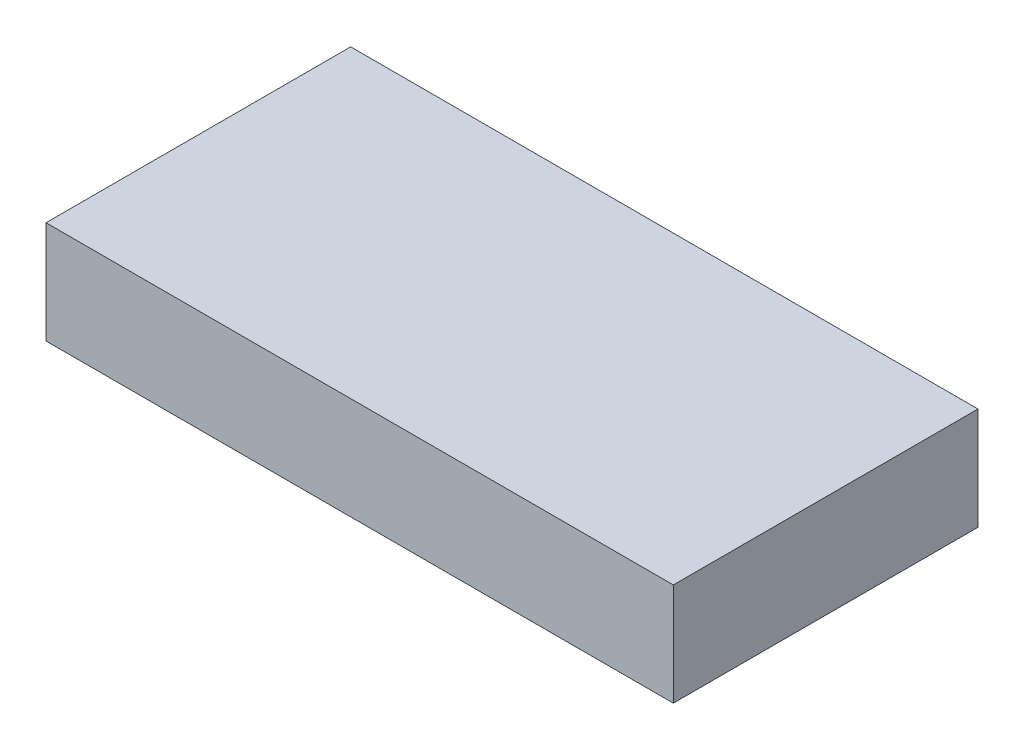
ISO-10303-21;
HEADER;
FILE_DESCRIPTION(('STEP AP214'),'2;1');
FILE_NAME('part.step','',(''),(''),'','','');
FILE_SCHEMA(('AUTOMOTIVE_DESIGN { 1 0 10303 214 1 1 1 1 }'));
ENDSEC;
DATA;
#1=APPLICATION_CONTEXT('core data for automotive mechanical design processes');
#2=APPLICATION_PROTOCOL_DEFINITION('international standard','automotive_design',2000,#1);
#3=PRODUCT_CONTEXT('',#1,'mechanical');
#4=PRODUCT('Part','Part','',(#3));
#5=PRODUCT_RELATED_PRODUCT_CATEGORY('part','',(#4));
#6=PRODUCT_DEFINITION_FORMATION('','',#4);
#7=PRODUCT_DEFINITION_CONTEXT('part definition',#1,'design');
#8=PRODUCT_DEFINITION('design','',#6,#7);
#9=PRODUCT_DEFINITION_SHAPE('','',#8);
#10=(LENGTH_UNIT() NAMED_UNIT(*) SI_UNIT(.MILLI.,.METRE.));
#11=(NAMED_UNIT(*) PLANE_ANGLE_UNIT() SI_UNIT($,.RADIAN.));
#12=(NAMED_UNIT(*) SI_UNIT($,.STERADIAN.) SOLID_ANGLE_UNIT());
#13=UNCERTAINTY_MEASURE_WITH_UNIT(LENGTH_MEASURE(1.E-05),#10,'distance_accuracy_value','');
#14=(GEOMETRIC_REPRESENTATION_CONTEXT(3) GLOBAL_UNCERTAINTY_ASSIGNED_CONTEXT((#13)) GLOBAL_UNIT_ASSIGNED_CONTEXT((#10,
#11,#12)) REPRESENTATION_CONTEXT('',''));
#15=CARTESIAN_POINT('',(0.,0.,0.));
#16=DIRECTION('',(0.,0.,1.));
#17=DIRECTION('',(1.,0.,0.));
#18=AXIS2_PLACEMENT_3D('',#15,#16,#17);
#19=CARTESIAN_POINT('',(0.,40.,0.));
#20=DIRECTION('',(1.,0.,0.));
#21=DIRECTION('',(0.,0.,-1.));
#22=AXIS2_PLACEMENT_3D('',#19,#20,#21);
#23=PLANE('',#22);
#24=DIRECTION('',(0.,0.,1.));
#25=VECTOR('',#24,1.);
#26=CARTESIAN_POINT('',(0.,0.,0.));
#27=LINE('',#26,#25);
#28=CARTESIAN_POINT('',(0.,0.,-119.));
#29=VERTEX_POINT('',#28);
#30=CARTESIAN_POINT('',(0.,0.,0.));
#31=VERTEX_POINT('',#30);
#32=EDGE_CURVE('E105',#29,#31,#27,.T.);
#33=ORIENTED_EDGE('',*,*,#32,.T.);
#34=DIRECTION('',(0.,-1.,0.));
#35=VECTOR('',#34,1.);
#36=CARTESIAN_POINT('',(0.,40.,0.));
#37=LINE('',#36,#35);
#38=CARTESIAN_POINT('',(0.,40.,0.));
#39=VERTEX_POINT('',#38);
#40=EDGE_CURVE('E11',#39,#31,#37,.T.);
#41=ORIENTED_EDGE('',*,*,#40,.F.);
#42=DIRECTION('',(0.,0.,1.));
#43=VECTOR('',#42,1.);
#44=CARTESIAN_POINT('',(0.,40.,0.));
#45=LINE('',#44,#43);
#46=CARTESIAN_POINT('',(0.,40.,-119.));
#47=VERTEX_POINT('',#46);
#48=EDGE_CURVE('E89',#47,#39,#45,.T.);
#49=ORIENTED_EDGE('',*,*,#48,.F.);
#50=DIRECTION('',(0.,-1.,0.));
#51=VECTOR('',#50,1.);
#52=CARTESIAN_POINT('',(0.,40.,-119.));
#53=LINE('',#52,#51);
#54=EDGE_CURVE('E97',#47,#29,#53,.T.);
#55=ORIENTED_EDGE('',*,*,#54,.T.);
#56=EDGE_LOOP('',(#33,#41,#49,#55));
#57=FACE_BOUND('',#56,.T.);
#58=ADVANCED_FACE('F39',(#57),#23,.F.);
#59=CARTESIAN_POINT('',(0.,40.,0.));
#60=DIRECTION('',(0.,0.,-1.));
#61=DIRECTION('',(-1.,0.,0.));
#62=AXIS2_PLACEMENT_3D('',#59,#60,#61);
#63=PLANE('',#62);
#64=DIRECTION('',(1.,0.,0.));
#65=VECTOR('',#64,1.);
#66=CARTESIAN_POINT('',(0.,0.,0.));
#67=LINE('',#66,#65);
#68=CARTESIAN_POINT('',(245.,0.,0.));
#69=VERTEX_POINT('',#68);
#70=EDGE_CURVE('E92',#31,#69,#67,.T.);
#71=ORIENTED_EDGE('',*,*,#70,.T.);
#72=DIRECTION('',(0.,-1.,0.));
#73=VECTOR('',#72,1.);
#74=CARTESIAN_POINT('',(245.,40.,0.));
#75=LINE('',#74,#73);
#76=CARTESIAN_POINT('',(245.,40.,0.));
#77=VERTEX_POINT('',#76);
#78=EDGE_CURVE('E50',#77,#69,#75,.T.);
#79=ORIENTED_EDGE('',*,*,#78,.F.);
#80=DIRECTION('',(1.,0.,0.));
#81=VECTOR('',#80,1.);
#82=CARTESIAN_POINT('',(0.,40.,0.));
#83=LINE('',#82,#81);
#84=EDGE_CURVE('E82',#39,#77,#83,.T.);
#85=ORIENTED_EDGE('',*,*,#84,.F.);
#86=ORIENTED_EDGE('',*,*,#40,.T.);
#87=EDGE_LOOP('',(#71,#79,#85,#86));
#88=FACE_BOUND('',#87,.T.);
#89=ADVANCED_FACE('F93',(#88),#63,.F.);
#90=CARTESIAN_POINT('',(245.,40.,0.));
#91=DIRECTION('',(-1.,0.,0.));
#92=DIRECTION('',(0.,0.,1.));
#93=AXIS2_PLACEMENT_3D('',#90,#91,#92);
#94=PLANE('',#93);
#95=DIRECTION('',(0.,0.,-1.));
#96=VECTOR('',#95,1.);
#97=CARTESIAN_POINT('',(245.,0.,0.));
#98=LINE('',#97,#96);
#99=CARTESIAN_POINT('',(245.,0.,-119.));
#100=VERTEX_POINT('',#99);
#101=EDGE_CURVE('E72',#69,#100,#98,.T.);
#102=ORIENTED_EDGE('',*,*,#101,.T.);
#103=DIRECTION('',(0.,-1.,0.));
#104=VECTOR('',#103,1.);
#105=CARTESIAN_POINT('',(245.,40.,-119.));
#106=LINE('',#105,#104);
#107=CARTESIAN_POINT('',(245.,40.,-119.));
#108=VERTEX_POINT('',#107);
#109=EDGE_CURVE('E94',#108,#100,#106,.T.);
#110=ORIENTED_EDGE('',*,*,#109,.F.);
#111=DIRECTION('',(0.,0.,-1.));
#112=VECTOR('',#111,1.);
#113=CARTESIAN_POINT('',(245.,40.,0.));
#114=LINE('',#113,#112);
#115=EDGE_CURVE('E88',#77,#108,#114,.T.);
#116=ORIENTED_EDGE('',*,*,#115,.F.);
#117=ORIENTED_EDGE('',*,*,#78,.T.);
#118=EDGE_LOOP('',(#102,#110,#116,#117));
#119=FACE_BOUND('',#118,.T.);
#120=ADVANCED_FACE('F96',(#119),#94,.F.);
#121=CARTESIAN_POINT('',(0.,40.,-119.));
#122=DIRECTION('',(0.,0.,1.));
#123=DIRECTION('',(1.,0.,0.));
#124=AXIS2_PLACEMENT_3D('',#121,#122,#123);
#125=PLANE('',#124);
#126=DIRECTION('',(-1.,0.,0.));
#127=VECTOR('',#126,1.);
#128=CARTESIAN_POINT('',(0.,0.,-119.));
#129=LINE('',#128,#127);
#130=EDGE_CURVE('E76',#100,#29,#129,.T.);
#131=ORIENTED_EDGE('',*,*,#130,.T.);
#132=ORIENTED_EDGE('',*,*,#54,.F.);
#133=DIRECTION('',(-1.,0.,0.));
#134=VECTOR('',#133,1.);
#135=CARTESIAN_POINT('',(0.,40.,-119.));
#136=LINE('',#135,#134);
#137=EDGE_CURVE('E54',#108,#47,#136,.T.);
#138=ORIENTED_EDGE('',*,*,#137,.F.);
#139=ORIENTED_EDGE('',*,*,#109,.T.);
#140=EDGE_LOOP('',(#131,#132,#138,#139));
#141=FACE_BOUND('',#140,.T.);
#142=ADVANCED_FACE('F108',(#141),#125,.F.);
#143=CARTESIAN_POINT('',(0.,40.,0.));
#144=DIRECTION('',(0.,-1.,0.));
#145=DIRECTION('',(0.,0.,-1.));
#146=AXIS2_PLACEMENT_3D('',#143,#144,#145);
#147=PLANE('',#146);
#148=ORIENTED_EDGE('',*,*,#48,.T.);
#149=ORIENTED_EDGE('',*,*,#84,.T.);
#150=ORIENTED_EDGE('',*,*,#115,.T.);
#151=ORIENTED_EDGE('',*,*,#137,.T.);
#152=EDGE_LOOP('',(#148,#149,#150,#151));
#153=FACE_BOUND('',#152,.T.);
#154=ADVANCED_FACE('F86',(#153),#147,.F.);
#155=CARTESIAN_POINT('',(0.,0.,0.));
#156=DIRECTION('',(0.,-1.,0.));
#157=DIRECTION('',(0.,0.,-1.));
#158=AXIS2_PLACEMENT_3D('',#155,#156,#157);
#159=PLANE('',#158);
#160=ORIENTED_EDGE('',*,*,#32,.F.);
#161=ORIENTED_EDGE('',*,*,#130,.F.);
#162=ORIENTED_EDGE('',*,*,#101,.F.);
#163=ORIENTED_EDGE('',*,*,#70,.F.);
#164=EDGE_LOOP('',(#160,#161,#162,#163));
#165=FACE_BOUND('',#164,.T.);
#166=ADVANCED_FACE('F115',(#165),#159,.T.);
#167=CLOSED_SHELL('',(#58,#89,#120,#142,#154,#166));
#168=MANIFOLD_SOLID_BREP('B2',#167);
#169=ADVANCED_BREP_SHAPE_REPRESENTATION('',(#18,#168),#14);
#170=SHAPE_DEFINITION_REPRESENTATION(#9,#169);
ENDSEC;
END-ISO-10303-21;
